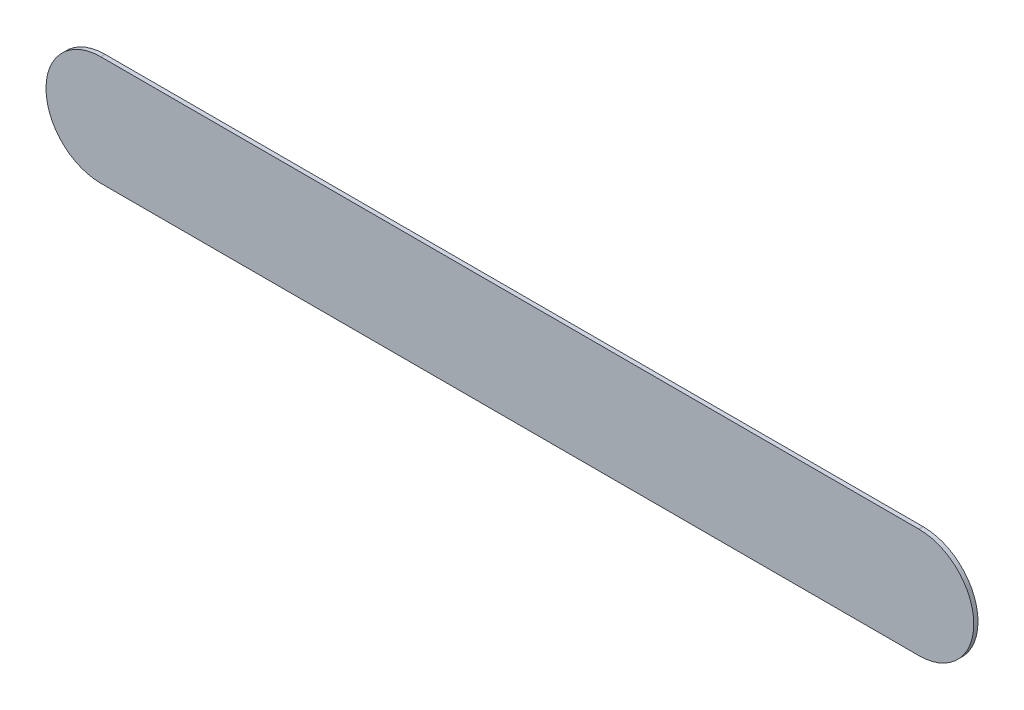
ISO-10303-21;
HEADER;
FILE_DESCRIPTION(('STEP AP214'),'2;1');
FILE_NAME('part.step','',(''),(''),'','','');
FILE_SCHEMA(('AUTOMOTIVE_DESIGN { 1 0 10303 214 1 1 1 1 }'));
ENDSEC;
DATA;
#1=APPLICATION_CONTEXT('core data for automotive mechanical design processes');
#2=APPLICATION_PROTOCOL_DEFINITION('international standard','automotive_design',2000,#1);
#3=PRODUCT_CONTEXT('',#1,'mechanical');
#4=PRODUCT('Part','Part','',(#3));
#5=PRODUCT_RELATED_PRODUCT_CATEGORY('part','',(#4));
#6=PRODUCT_DEFINITION_FORMATION('','',#4);
#7=PRODUCT_DEFINITION_CONTEXT('part definition',#1,'design');
#8=PRODUCT_DEFINITION('design','',#6,#7);
#9=PRODUCT_DEFINITION_SHAPE('','',#8);
#10=(LENGTH_UNIT() NAMED_UNIT(*) SI_UNIT(.MILLI.,.METRE.));
#11=(NAMED_UNIT(*) PLANE_ANGLE_UNIT() SI_UNIT($,.RADIAN.));
#12=(NAMED_UNIT(*) SI_UNIT($,.STERADIAN.) SOLID_ANGLE_UNIT());
#13=UNCERTAINTY_MEASURE_WITH_UNIT(LENGTH_MEASURE(1.E-05),#10,'distance_accuracy_value','');
#14=(GEOMETRIC_REPRESENTATION_CONTEXT(3) GLOBAL_UNCERTAINTY_ASSIGNED_CONTEXT((#13)) GLOBAL_UNIT_ASSIGNED_CONTEXT((#10,
#11,#12)) REPRESENTATION_CONTEXT('',''));
#15=CARTESIAN_POINT('',(0.,0.,0.));
#16=DIRECTION('',(0.,0.,1.));
#17=DIRECTION('',(1.,0.,0.));
#18=AXIS2_PLACEMENT_3D('',#15,#16,#17);
#19=CARTESIAN_POINT('',(168.59,-116.09,1.635));
#20=DIRECTION('',(0.,0.,1.));
#21=DIRECTION('',(1.,0.,0.));
#22=AXIS2_PLACEMENT_3D('',#19,#20,#21);
#23=PLANE('',#22);
#24=DIRECTION('',(-1.,0.,0.));
#25=VECTOR('',#24,1.);
#26=CARTESIAN_POINT('',(168.59,-116.09,1.635));
#27=LINE('',#26,#25);
#28=CARTESIAN_POINT('',(168.59,-116.09,1.635));
#29=VERTEX_POINT('',#28);
#30=CARTESIAN_POINT('',(161.87,-116.09,1.635));
#31=VERTEX_POINT('',#30);
#32=EDGE_CURVE('E71',#29,#31,#27,.T.);
#33=ORIENTED_EDGE('',*,*,#32,.T.);
#34=CARTESIAN_POINT('',(161.87,-116.54,1.635));
#35=DIRECTION('',(0.,0.,1.));
#36=DIRECTION('',(0.,1.,0.));
#37=AXIS2_PLACEMENT_3D('',#34,#35,#36);
#38=CIRCLE('',#37,0.45);
#39=CARTESIAN_POINT('',(161.87,-116.99,1.635));
#40=VERTEX_POINT('',#39);
#41=EDGE_CURVE('E103',#31,#40,#38,.T.);
#42=ORIENTED_EDGE('',*,*,#41,.T.);
#43=DIRECTION('',(1.,0.,0.));
#44=VECTOR('',#43,1.);
#45=CARTESIAN_POINT('',(161.87,-116.99,1.635));
#46=LINE('',#45,#44);
#47=CARTESIAN_POINT('',(168.59,-116.99,1.635));
#48=VERTEX_POINT('',#47);
#49=EDGE_CURVE('E73',#40,#48,#46,.T.);
#50=ORIENTED_EDGE('',*,*,#49,.T.);
#51=CARTESIAN_POINT('',(168.59,-116.54,1.635));
#52=DIRECTION('',(0.,0.,1.));
#53=DIRECTION('',(0.,-1.,0.));
#54=AXIS2_PLACEMENT_3D('',#51,#52,#53);
#55=CIRCLE('',#54,0.45);
#56=EDGE_CURVE('E11',#48,#29,#55,.T.);
#57=ORIENTED_EDGE('',*,*,#56,.T.);
#58=EDGE_LOOP('',(#33,#42,#50,#57));
#59=FACE_BOUND('',#58,.T.);
#60=ADVANCED_FACE('F17',(#59),#23,.T.);
#61=CARTESIAN_POINT('',(168.59,-116.09,1.6));
#62=DIRECTION('',(0.,0.,1.));
#63=DIRECTION('',(1.,0.,0.));
#64=AXIS2_PLACEMENT_3D('',#61,#62,#63);
#65=PLANE('',#64);
#66=CARTESIAN_POINT('',(168.59,-116.54,1.6));
#67=DIRECTION('',(0.,0.,1.));
#68=DIRECTION('',(0.,-1.,0.));
#69=AXIS2_PLACEMENT_3D('',#66,#67,#68);
#70=CIRCLE('',#69,0.45);
#71=CARTESIAN_POINT('',(168.59,-116.99,1.6));
#72=VERTEX_POINT('',#71);
#73=CARTESIAN_POINT('',(168.59,-116.09,1.6));
#74=VERTEX_POINT('',#73);
#75=EDGE_CURVE('E20',#72,#74,#70,.T.);
#76=ORIENTED_EDGE('',*,*,#75,.F.);
#77=DIRECTION('',(1.,0.,0.));
#78=VECTOR('',#77,1.);
#79=CARTESIAN_POINT('',(161.87,-116.99,1.6));
#80=LINE('',#79,#78);
#81=CARTESIAN_POINT('',(161.87,-116.99,1.6));
#82=VERTEX_POINT('',#81);
#83=EDGE_CURVE('E106',#82,#72,#80,.T.);
#84=ORIENTED_EDGE('',*,*,#83,.F.);
#85=CARTESIAN_POINT('',(161.87,-116.54,1.6));
#86=DIRECTION('',(0.,0.,1.));
#87=DIRECTION('',(0.,1.,0.));
#88=AXIS2_PLACEMENT_3D('',#85,#86,#87);
#89=CIRCLE('',#88,0.45);
#90=CARTESIAN_POINT('',(161.87,-116.09,1.6));
#91=VERTEX_POINT('',#90);
#92=EDGE_CURVE('E81',#91,#82,#89,.T.);
#93=ORIENTED_EDGE('',*,*,#92,.F.);
#94=DIRECTION('',(-1.,0.,0.));
#95=VECTOR('',#94,1.);
#96=CARTESIAN_POINT('',(168.59,-116.09,1.6));
#97=LINE('',#96,#95);
#98=EDGE_CURVE('E92',#74,#91,#97,.T.);
#99=ORIENTED_EDGE('',*,*,#98,.F.);
#100=EDGE_LOOP('',(#76,#84,#93,#99));
#101=FACE_BOUND('',#100,.T.);
#102=ADVANCED_FACE('F156',(#101),#65,.F.);
#103=CARTESIAN_POINT('',(168.59,-116.54,1.6));
#104=DIRECTION('',(0.,0.,-1.));
#105=DIRECTION('',(0.,-1.,0.));
#106=AXIS2_PLACEMENT_3D('',#103,#104,#105);
#107=CYLINDRICAL_SURFACE('',#106,0.45);
#108=ORIENTED_EDGE('',*,*,#75,.T.);
#109=DIRECTION('',(0.,0.,1.));
#110=VECTOR('',#109,1.);
#111=CARTESIAN_POINT('',(168.59,-116.09,1.6));
#112=LINE('',#111,#110);
#113=EDGE_CURVE('E76',#74,#29,#112,.T.);
#114=ORIENTED_EDGE('',*,*,#113,.T.);
#115=ORIENTED_EDGE('',*,*,#56,.F.);
#116=DIRECTION('',(0.,0.,1.));
#117=VECTOR('',#116,1.);
#118=CARTESIAN_POINT('',(168.59,-116.99,1.6));
#119=LINE('',#118,#117);
#120=EDGE_CURVE('E107',#72,#48,#119,.T.);
#121=ORIENTED_EDGE('',*,*,#120,.F.);
#122=EDGE_LOOP('',(#108,#114,#115,#121));
#123=FACE_BOUND('',#122,.T.);
#124=ADVANCED_FACE('F77',(#123),#107,.T.);
#125=CARTESIAN_POINT('',(161.87,-116.99,1.6));
#126=DIRECTION('',(0.,1.,0.));
#127=DIRECTION('',(1.,0.,0.));
#128=AXIS2_PLACEMENT_3D('',#125,#126,#127);
#129=PLANE('',#128);
#130=ORIENTED_EDGE('',*,*,#83,.T.);
#131=ORIENTED_EDGE('',*,*,#120,.T.);
#132=ORIENTED_EDGE('',*,*,#49,.F.);
#133=DIRECTION('',(0.,0.,1.));
#134=VECTOR('',#133,1.);
#135=CARTESIAN_POINT('',(161.87,-116.99,1.6));
#136=LINE('',#135,#134);
#137=EDGE_CURVE('E98',#82,#40,#136,.T.);
#138=ORIENTED_EDGE('',*,*,#137,.F.);
#139=EDGE_LOOP('',(#130,#131,#132,#138));
#140=FACE_BOUND('',#139,.T.);
#141=ADVANCED_FACE('F137',(#140),#129,.F.);
#142=CARTESIAN_POINT('',(161.87,-116.54,1.6));
#143=DIRECTION('',(0.,0.,-1.));
#144=DIRECTION('',(0.,1.,0.));
#145=AXIS2_PLACEMENT_3D('',#142,#143,#144);
#146=CYLINDRICAL_SURFACE('',#145,0.45);
#147=ORIENTED_EDGE('',*,*,#92,.T.);
#148=ORIENTED_EDGE('',*,*,#137,.T.);
#149=ORIENTED_EDGE('',*,*,#41,.F.);
#150=DIRECTION('',(0.,0.,1.));
#151=VECTOR('',#150,1.);
#152=CARTESIAN_POINT('',(161.87,-116.09,1.6));
#153=LINE('',#152,#151);
#154=EDGE_CURVE('E85',#91,#31,#153,.T.);
#155=ORIENTED_EDGE('',*,*,#154,.F.);
#156=EDGE_LOOP('',(#147,#148,#149,#155));
#157=FACE_BOUND('',#156,.T.);
#158=ADVANCED_FACE('F127',(#157),#146,.T.);
#159=CARTESIAN_POINT('',(168.59,-116.09,1.6));
#160=DIRECTION('',(0.,-1.,0.));
#161=DIRECTION('',(0.,0.,-1.));
#162=AXIS2_PLACEMENT_3D('',#159,#160,#161);
#163=PLANE('',#162);
#164=ORIENTED_EDGE('',*,*,#98,.T.);
#165=ORIENTED_EDGE('',*,*,#154,.T.);
#166=ORIENTED_EDGE('',*,*,#32,.F.);
#167=ORIENTED_EDGE('',*,*,#113,.F.);
#168=EDGE_LOOP('',(#164,#165,#166,#167));
#169=FACE_BOUND('',#168,.T.);
#170=ADVANCED_FACE('F83',(#169),#163,.F.);
#171=CLOSED_SHELL('',(#60,#102,#124,#141,#158,#170));
#172=MANIFOLD_SOLID_BREP('B1',#171);
#173=ADVANCED_BREP_SHAPE_REPRESENTATION('',(#18,#172),#14);
#174=SHAPE_DEFINITION_REPRESENTATION(#9,#173);
ENDSEC;
END-ISO-10303-21;
